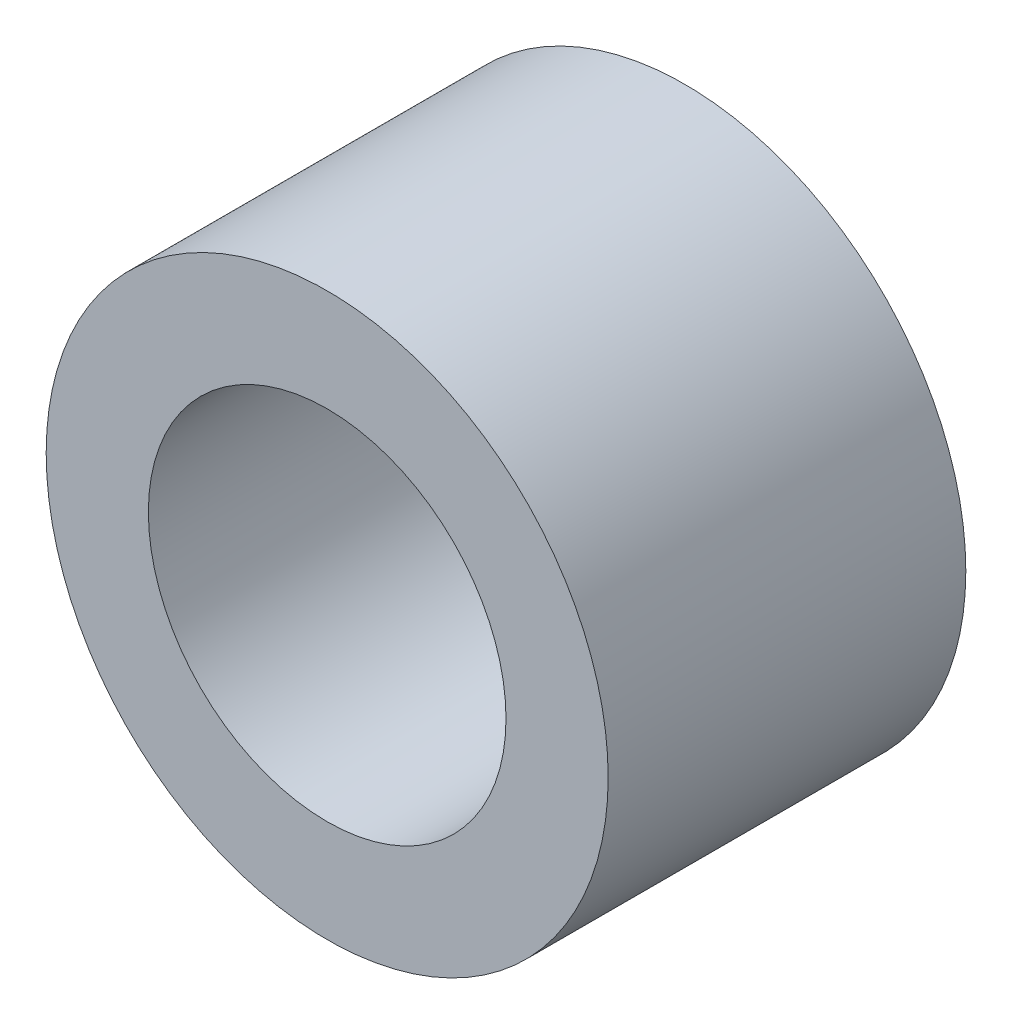
ISO-10303-21;
HEADER;
FILE_DESCRIPTION(('STEP AP214'),'2;1');
FILE_NAME('part.step','',(''),(''),'','','');
FILE_SCHEMA(('AUTOMOTIVE_DESIGN { 1 0 10303 214 1 1 1 1 }'));
ENDSEC;
DATA;
#1=APPLICATION_CONTEXT('core data for automotive mechanical design processes');
#2=APPLICATION_PROTOCOL_DEFINITION('international standard','automotive_design',2000,#1);
#3=PRODUCT_CONTEXT('',#1,'mechanical');
#4=PRODUCT('Part','Part','',(#3));
#5=PRODUCT_RELATED_PRODUCT_CATEGORY('part','',(#4));
#6=PRODUCT_DEFINITION_FORMATION('','',#4);
#7=PRODUCT_DEFINITION_CONTEXT('part definition',#1,'design');
#8=PRODUCT_DEFINITION('design','',#6,#7);
#9=PRODUCT_DEFINITION_SHAPE('','',#8);
#10=(LENGTH_UNIT() NAMED_UNIT(*) SI_UNIT(.MILLI.,.METRE.));
#11=(NAMED_UNIT(*) PLANE_ANGLE_UNIT() SI_UNIT($,.RADIAN.));
#12=(NAMED_UNIT(*) SI_UNIT($,.STERADIAN.) SOLID_ANGLE_UNIT());
#13=UNCERTAINTY_MEASURE_WITH_UNIT(LENGTH_MEASURE(1.E-05),#10,'distance_accuracy_value','');
#14=(GEOMETRIC_REPRESENTATION_CONTEXT(3) GLOBAL_UNCERTAINTY_ASSIGNED_CONTEXT((#13)) GLOBAL_UNIT_ASSIGNED_CONTEXT((#10,
#11,#12)) REPRESENTATION_CONTEXT('',''));
#15=CARTESIAN_POINT('',(0.,0.,0.));
#16=DIRECTION('',(0.,0.,1.));
#17=DIRECTION('',(1.,0.,0.));
#18=AXIS2_PLACEMENT_3D('',#15,#16,#17);
#19=CARTESIAN_POINT('',(0.,0.,3.5));
#20=DIRECTION('',(0.,0.,1.));
#21=DIRECTION('',(1.,0.,0.));
#22=AXIS2_PLACEMENT_3D('',#19,#20,#21);
#23=PLANE('',#22);
#24=CARTESIAN_POINT('',(0.,0.,3.5));
#25=DIRECTION('',(0.,0.,1.));
#26=DIRECTION('',(1.,0.,0.));
#27=AXIS2_PLACEMENT_3D('',#24,#25,#26);
#28=CIRCLE('',#27,2.75);
#29=CARTESIAN_POINT('',(2.75,0.,3.5));
#30=VERTEX_POINT('',#29);
#31=EDGE_CURVE('E10',#30,#30,#28,.T.);
#32=ORIENTED_EDGE('',*,*,#31,.T.);
#33=EDGE_LOOP('',(#32));
#34=FACE_BOUND('',#33,.T.);
#35=CARTESIAN_POINT('',(0.,0.,3.5));
#36=DIRECTION('',(0.,0.,1.));
#37=DIRECTION('',(1.,0.,0.));
#38=AXIS2_PLACEMENT_3D('',#35,#36,#37);
#39=CIRCLE('',#38,1.75);
#40=CARTESIAN_POINT('',(1.75,0.,3.5));
#41=VERTEX_POINT('',#40);
#42=EDGE_CURVE('E56',#41,#41,#39,.T.);
#43=ORIENTED_EDGE('',*,*,#42,.F.);
#44=EDGE_LOOP('',(#43));
#45=FACE_BOUND('',#44,.T.);
#46=ADVANCED_FACE('F43',(#34,#45),#23,.T.);
#47=CARTESIAN_POINT('',(0.,0.,0.));
#48=DIRECTION('',(0.,0.,1.));
#49=DIRECTION('',(1.,0.,0.));
#50=AXIS2_PLACEMENT_3D('',#47,#48,#49);
#51=PLANE('',#50);
#52=CARTESIAN_POINT('',(0.,0.,0.));
#53=DIRECTION('',(0.,0.,1.));
#54=DIRECTION('',(1.,0.,0.));
#55=AXIS2_PLACEMENT_3D('',#52,#53,#54);
#56=CIRCLE('',#55,2.75);
#57=CARTESIAN_POINT('',(2.75,0.,0.));
#58=VERTEX_POINT('',#57);
#59=EDGE_CURVE('E47',#58,#58,#56,.T.);
#60=ORIENTED_EDGE('',*,*,#59,.F.);
#61=EDGE_LOOP('',(#60));
#62=FACE_BOUND('',#61,.T.);
#63=CARTESIAN_POINT('',(0.,0.,0.));
#64=DIRECTION('',(0.,0.,1.));
#65=DIRECTION('',(1.,0.,0.));
#66=AXIS2_PLACEMENT_3D('',#63,#64,#65);
#67=CIRCLE('',#66,1.75);
#68=CARTESIAN_POINT('',(1.75,0.,0.));
#69=VERTEX_POINT('',#68);
#70=EDGE_CURVE('E58',#69,#69,#67,.T.);
#71=ORIENTED_EDGE('',*,*,#70,.T.);
#72=EDGE_LOOP('',(#71));
#73=FACE_BOUND('',#72,.T.);
#74=ADVANCED_FACE('F70',(#62,#73),#51,.F.);
#75=CARTESIAN_POINT('',(0.,0.,3.5));
#76=DIRECTION('',(0.,0.,-1.));
#77=DIRECTION('',(-1.,0.,0.));
#78=AXIS2_PLACEMENT_3D('',#75,#76,#77);
#79=CYLINDRICAL_SURFACE('',#78,2.75);
#80=ORIENTED_EDGE('',*,*,#31,.F.);
#81=EDGE_LOOP('',(#80));
#82=FACE_BOUND('',#81,.T.);
#83=ORIENTED_EDGE('',*,*,#59,.T.);
#84=EDGE_LOOP('',(#83));
#85=FACE_BOUND('',#84,.T.);
#86=ADVANCED_FACE('F45',(#82,#85),#79,.T.);
#87=CARTESIAN_POINT('',(0.,0.,3.5));
#88=DIRECTION('',(0.,0.,-1.));
#89=DIRECTION('',(-1.,0.,0.));
#90=AXIS2_PLACEMENT_3D('',#87,#88,#89);
#91=CYLINDRICAL_SURFACE('',#90,1.75);
#92=ORIENTED_EDGE('',*,*,#42,.T.);
#93=EDGE_LOOP('',(#92));
#94=FACE_BOUND('',#93,.T.);
#95=ORIENTED_EDGE('',*,*,#70,.F.);
#96=EDGE_LOOP('',(#95));
#97=FACE_BOUND('',#96,.T.);
#98=ADVANCED_FACE('F66',(#94,#97),#91,.F.);
#99=CLOSED_SHELL('',(#46,#74,#86,#98));
#100=MANIFOLD_SOLID_BREP('B2',#99);
#101=ADVANCED_BREP_SHAPE_REPRESENTATION('',(#18,#100),#14);
#102=SHAPE_DEFINITION_REPRESENTATION(#9,#101);
ENDSEC;
END-ISO-10303-21;
